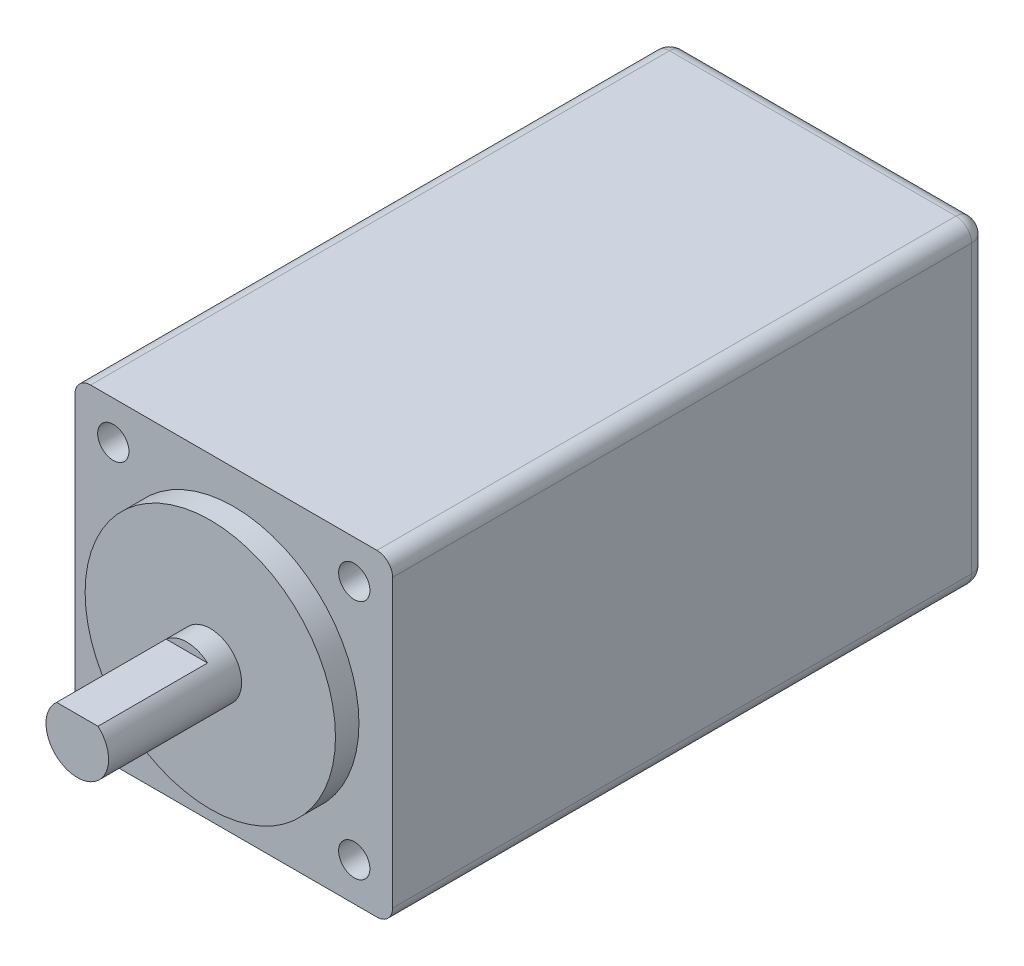
ISO-10303-21;
HEADER;
FILE_DESCRIPTION(('STEP AP214'),'2;1');
FILE_NAME('part.step','',(''),(''),'','','');
FILE_SCHEMA(('AUTOMOTIVE_DESIGN { 1 0 10303 214 1 1 1 1 }'));
ENDSEC;
DATA;
#1=APPLICATION_CONTEXT('core data for automotive mechanical design processes');
#2=APPLICATION_PROTOCOL_DEFINITION('international standard','automotive_design',2000,#1);
#3=PRODUCT_CONTEXT('',#1,'mechanical');
#4=PRODUCT('Part','Part','',(#3));
#5=PRODUCT_RELATED_PRODUCT_CATEGORY('part','',(#4));
#6=PRODUCT_DEFINITION_FORMATION('','',#4);
#7=PRODUCT_DEFINITION_CONTEXT('part definition',#1,'design');
#8=PRODUCT_DEFINITION('design','',#6,#7);
#9=PRODUCT_DEFINITION_SHAPE('','',#8);
#10=(LENGTH_UNIT() NAMED_UNIT(*) SI_UNIT(.MILLI.,.METRE.));
#11=(NAMED_UNIT(*) PLANE_ANGLE_UNIT() SI_UNIT($,.RADIAN.));
#12=(NAMED_UNIT(*) SI_UNIT($,.STERADIAN.) SOLID_ANGLE_UNIT());
#13=UNCERTAINTY_MEASURE_WITH_UNIT(LENGTH_MEASURE(1.E-05),#10,'distance_accuracy_value','');
#14=(GEOMETRIC_REPRESENTATION_CONTEXT(3) GLOBAL_UNCERTAINTY_ASSIGNED_CONTEXT((#13)) GLOBAL_UNIT_ASSIGNED_CONTEXT((#10,
#11,#12)) REPRESENTATION_CONTEXT('',''));
#15=CARTESIAN_POINT('',(0.,0.,0.));
#16=DIRECTION('',(0.,0.,1.));
#17=DIRECTION('',(1.,0.,0.));
#18=AXIS2_PLACEMENT_3D('',#15,#16,#17);
#19=CARTESIAN_POINT('',(0.,0.,39.5));
#20=DIRECTION('',(0.,0.,1.));
#21=DIRECTION('',(1.,0.,0.));
#22=AXIS2_PLACEMENT_3D('',#19,#20,#21);
#23=PLANE('',#22);
#24=CARTESIAN_POINT('',(0.,0.,39.5));
#25=DIRECTION('',(0.,0.,1.));
#26=DIRECTION('',(1.,0.,0.));
#27=AXIS2_PLACEMENT_3D('',#24,#25,#26);
#28=CIRCLE('',#27,8.);
#29=CARTESIAN_POINT('',(8.,0.,39.5));
#30=VERTEX_POINT('',#29);
#31=EDGE_CURVE('E144',#30,#30,#28,.T.);
#32=ORIENTED_EDGE('',*,*,#31,.T.);
#33=EDGE_LOOP('',(#32));
#34=FACE_BOUND('',#33,.T.);
#35=CARTESIAN_POINT('',(0.,0.,39.5));
#36=DIRECTION('',(0.,0.,1.));
#37=DIRECTION('',(1.,0.,0.));
#38=AXIS2_PLACEMENT_3D('',#35,#36,#37);
#39=CIRCLE('',#38,2.);
#40=CARTESIAN_POINT('',(2.,0.,39.5));
#41=VERTEX_POINT('',#40);
#42=EDGE_CURVE('E145',#41,#41,#39,.T.);
#43=ORIENTED_EDGE('',*,*,#42,.F.);
#44=EDGE_LOOP('',(#43));
#45=FACE_BOUND('',#44,.T.);
#46=ADVANCED_FACE('F33',(#34,#45),#23,.T.);
#47=CARTESIAN_POINT('',(10.15,10.15,38.));
#48=DIRECTION('',(0.,0.,-1.));
#49=DIRECTION('',(-1.,0.,0.));
#50=AXIS2_PLACEMENT_3D('',#47,#48,#49);
#51=PLANE('',#50);
#52=CARTESIAN_POINT('',(-7.69999999999969,-7.7,38.));
#53=DIRECTION('',(0.,0.,1.));
#54=DIRECTION('',(1.,0.,0.));
#55=AXIS2_PLACEMENT_3D('',#52,#53,#54);
#56=CIRCLE('',#55,1.);
#57=CARTESIAN_POINT('',(-6.69999999999969,-7.7,38.));
#58=VERTEX_POINT('',#57);
#59=EDGE_CURVE('E237',#58,#58,#56,.T.);
#60=ORIENTED_EDGE('',*,*,#59,.F.);
#61=EDGE_LOOP('',(#60));
#62=FACE_BOUND('',#61,.T.);
#63=CARTESIAN_POINT('',(7.70000000000031,-7.69999999999969,38.));
#64=DIRECTION('',(0.,0.,1.));
#65=DIRECTION('',(1.,0.,0.));
#66=AXIS2_PLACEMENT_3D('',#63,#64,#65);
#67=CIRCLE('',#66,1.);
#68=CARTESIAN_POINT('',(8.70000000000032,-7.69999999999969,38.));
#69=VERTEX_POINT('',#68);
#70=EDGE_CURVE('E245',#69,#69,#67,.T.);
#71=ORIENTED_EDGE('',*,*,#70,.F.);
#72=EDGE_LOOP('',(#71));
#73=FACE_BOUND('',#72,.T.);
#74=CARTESIAN_POINT('',(7.7,7.70000000000031,38.));
#75=DIRECTION('',(0.,0.,1.));
#76=DIRECTION('',(1.,0.,0.));
#77=AXIS2_PLACEMENT_3D('',#74,#75,#76);
#78=CIRCLE('',#77,1.);
#79=CARTESIAN_POINT('',(8.7,7.70000000000031,38.));
#80=VERTEX_POINT('',#79);
#81=EDGE_CURVE('E251',#80,#80,#78,.T.);
#82=ORIENTED_EDGE('',*,*,#81,.F.);
#83=EDGE_LOOP('',(#82));
#84=FACE_BOUND('',#83,.T.);
#85=CARTESIAN_POINT('',(-7.7,7.7,38.));
#86=DIRECTION('',(0.,0.,1.));
#87=DIRECTION('',(1.,0.,0.));
#88=AXIS2_PLACEMENT_3D('',#85,#86,#87);
#89=CIRCLE('',#88,1.);
#90=CARTESIAN_POINT('',(-6.7,7.7,38.));
#91=VERTEX_POINT('',#90);
#92=EDGE_CURVE('E257',#91,#91,#89,.T.);
#93=ORIENTED_EDGE('',*,*,#92,.F.);
#94=EDGE_LOOP('',(#93));
#95=FACE_BOUND('',#94,.T.);
#96=DIRECTION('',(0.,-1.,0.));
#97=VECTOR('',#96,1.);
#98=CARTESIAN_POINT('',(-10.15,-10.15,38.));
#99=LINE('',#98,#97);
#100=CARTESIAN_POINT('',(-10.15,9.15,38.));
#101=VERTEX_POINT('',#100);
#102=CARTESIAN_POINT('',(-10.15,-9.15,38.));
#103=VERTEX_POINT('',#102);
#104=EDGE_CURVE('E159',#101,#103,#99,.T.);
#105=ORIENTED_EDGE('',*,*,#104,.T.);
#106=CARTESIAN_POINT('',(-9.15,-9.15,38.));
#107=DIRECTION('',(0.,0.,-1.));
#108=DIRECTION('',(-1.,0.,0.));
#109=AXIS2_PLACEMENT_3D('',#106,#107,#108);
#110=CIRCLE('',#109,1.);
#111=CARTESIAN_POINT('',(-9.15,-10.15,38.));
#112=VERTEX_POINT('',#111);
#113=EDGE_CURVE('E11',#103,#112,#110,.F.);
#114=ORIENTED_EDGE('',*,*,#113,.T.);
#115=DIRECTION('',(1.,0.,0.));
#116=VECTOR('',#115,1.);
#117=CARTESIAN_POINT('',(-10.15,-10.15,38.));
#118=LINE('',#117,#116);
#119=CARTESIAN_POINT('',(9.15,-10.15,38.));
#120=VERTEX_POINT('',#119);
#121=EDGE_CURVE('E162',#112,#120,#118,.T.);
#122=ORIENTED_EDGE('',*,*,#121,.T.);
#123=CARTESIAN_POINT('',(9.15,-9.15,38.));
#124=DIRECTION('',(0.,0.,-1.));
#125=DIRECTION('',(-1.,0.,0.));
#126=AXIS2_PLACEMENT_3D('',#123,#124,#125);
#127=CIRCLE('',#126,1.);
#128=CARTESIAN_POINT('',(10.15,-9.15,38.));
#129=VERTEX_POINT('',#128);
#130=EDGE_CURVE('E42',#120,#129,#127,.F.);
#131=ORIENTED_EDGE('',*,*,#130,.T.);
#132=DIRECTION('',(0.,1.,0.));
#133=VECTOR('',#132,1.);
#134=CARTESIAN_POINT('',(10.15,-10.15,38.));
#135=LINE('',#134,#133);
#136=CARTESIAN_POINT('',(10.15,9.15,38.));
#137=VERTEX_POINT('',#136);
#138=EDGE_CURVE('E148',#129,#137,#135,.T.);
#139=ORIENTED_EDGE('',*,*,#138,.T.);
#140=CARTESIAN_POINT('',(9.15,9.15,38.));
#141=DIRECTION('',(0.,0.,-1.));
#142=DIRECTION('',(-1.,0.,0.));
#143=AXIS2_PLACEMENT_3D('',#140,#141,#142);
#144=CIRCLE('',#143,1.);
#145=CARTESIAN_POINT('',(9.15,10.15,38.));
#146=VERTEX_POINT('',#145);
#147=EDGE_CURVE('E200',#137,#146,#144,.F.);
#148=ORIENTED_EDGE('',*,*,#147,.T.);
#149=DIRECTION('',(-1.,0.,0.));
#150=VECTOR('',#149,1.);
#151=CARTESIAN_POINT('',(-10.15,10.15,38.));
#152=LINE('',#151,#150);
#153=CARTESIAN_POINT('',(-9.15,10.15,38.));
#154=VERTEX_POINT('',#153);
#155=EDGE_CURVE('E156',#146,#154,#152,.T.);
#156=ORIENTED_EDGE('',*,*,#155,.T.);
#157=CARTESIAN_POINT('',(-9.15,9.15,38.));
#158=DIRECTION('',(0.,0.,-1.));
#159=DIRECTION('',(-1.,0.,0.));
#160=AXIS2_PLACEMENT_3D('',#157,#158,#159);
#161=CIRCLE('',#160,1.);
#162=EDGE_CURVE('E202',#154,#101,#161,.F.);
#163=ORIENTED_EDGE('',*,*,#162,.T.);
#164=EDGE_LOOP('',(#105,#114,#122,#131,#139,#148,#156,#163));
#165=FACE_BOUND('',#164,.T.);
#166=CARTESIAN_POINT('',(0.,0.,38.));
#167=DIRECTION('',(0.,0.,-1.));
#168=DIRECTION('',(-1.,0.,0.));
#169=AXIS2_PLACEMENT_3D('',#166,#167,#168);
#170=CIRCLE('',#169,8.);
#171=CARTESIAN_POINT('',(-8.,0.,38.));
#172=VERTEX_POINT('',#171);
#173=EDGE_CURVE('E134',#172,#172,#170,.F.);
#174=ORIENTED_EDGE('',*,*,#173,.F.);
#175=EDGE_LOOP('',(#174));
#176=FACE_BOUND('',#175,.T.);
#177=ADVANCED_FACE('F278',(#62,#73,#84,#95,#165,#176),#51,.F.);
#178=CARTESIAN_POINT('',(10.15,-10.15,38.));
#179=DIRECTION('',(-1.,0.,0.));
#180=DIRECTION('',(0.,0.,1.));
#181=AXIS2_PLACEMENT_3D('',#178,#179,#180);
#182=PLANE('',#181);
#183=ORIENTED_EDGE('',*,*,#138,.F.);
#184=DIRECTION('',(0.,0.,-1.));
#185=VECTOR('',#184,1.);
#186=CARTESIAN_POINT('',(10.15,-9.15,38.));
#187=LINE('',#186,#185);
#188=CARTESIAN_POINT('',(10.15,-9.15,1.));
#189=VERTEX_POINT('',#188);
#190=EDGE_CURVE('E50',#129,#189,#187,.T.);
#191=ORIENTED_EDGE('',*,*,#190,.T.);
#192=DIRECTION('',(0.,1.,0.));
#193=VECTOR('',#192,1.);
#194=CARTESIAN_POINT('',(10.15,10.15,1.));
#195=LINE('',#194,#193);
#196=CARTESIAN_POINT('',(10.15,9.15,1.));
#197=VERTEX_POINT('',#196);
#198=EDGE_CURVE('E55',#189,#197,#195,.T.);
#199=ORIENTED_EDGE('',*,*,#198,.T.);
#200=DIRECTION('',(0.,0.,-1.));
#201=VECTOR('',#200,1.);
#202=CARTESIAN_POINT('',(10.15,9.15,38.));
#203=LINE('',#202,#201);
#204=EDGE_CURVE('E196',#197,#137,#203,.F.);
#205=ORIENTED_EDGE('',*,*,#204,.T.);
#206=EDGE_LOOP('',(#183,#191,#199,#205));
#207=FACE_BOUND('',#206,.T.);
#208=ADVANCED_FACE('F284',(#207),#182,.F.);
#209=CARTESIAN_POINT('',(-10.15,10.15,38.));
#210=DIRECTION('',(0.,-1.,0.));
#211=DIRECTION('',(0.,0.,-1.));
#212=AXIS2_PLACEMENT_3D('',#209,#210,#211);
#213=PLANE('',#212);
#214=DIRECTION('',(-1.,0.,0.));
#215=VECTOR('',#214,1.);
#216=CARTESIAN_POINT('',(-10.15,10.15,1.));
#217=LINE('',#216,#215);
#218=CARTESIAN_POINT('',(9.15,10.15,1.));
#219=VERTEX_POINT('',#218);
#220=CARTESIAN_POINT('',(-9.15,10.15,1.));
#221=VERTEX_POINT('',#220);
#222=EDGE_CURVE('E170',#219,#221,#217,.T.);
#223=ORIENTED_EDGE('',*,*,#222,.T.);
#224=DIRECTION('',(0.,0.,-1.));
#225=VECTOR('',#224,1.);
#226=CARTESIAN_POINT('',(-9.15,10.15,38.));
#227=LINE('',#226,#225);
#228=EDGE_CURVE('E173',#221,#154,#227,.F.);
#229=ORIENTED_EDGE('',*,*,#228,.T.);
#230=ORIENTED_EDGE('',*,*,#155,.F.);
#231=DIRECTION('',(0.,0.,-1.));
#232=VECTOR('',#231,1.);
#233=CARTESIAN_POINT('',(9.15,10.15,38.));
#234=LINE('',#233,#232);
#235=EDGE_CURVE('E168',#146,#219,#234,.T.);
#236=ORIENTED_EDGE('',*,*,#235,.T.);
#237=EDGE_LOOP('',(#223,#229,#230,#236));
#238=FACE_BOUND('',#237,.T.);
#239=ADVANCED_FACE('F305',(#238),#213,.F.);
#240=CARTESIAN_POINT('',(-10.15,-10.15,38.));
#241=DIRECTION('',(1.,0.,0.));
#242=DIRECTION('',(0.,0.,-1.));
#243=AXIS2_PLACEMENT_3D('',#240,#241,#242);
#244=PLANE('',#243);
#245=DIRECTION('',(0.,-1.,0.));
#246=VECTOR('',#245,1.);
#247=CARTESIAN_POINT('',(-10.15,-10.15,1.));
#248=LINE('',#247,#246);
#249=CARTESIAN_POINT('',(-10.15,9.15,1.));
#250=VERTEX_POINT('',#249);
#251=CARTESIAN_POINT('',(-10.15,-9.15,1.));
#252=VERTEX_POINT('',#251);
#253=EDGE_CURVE('E186',#250,#252,#248,.T.);
#254=ORIENTED_EDGE('',*,*,#253,.T.);
#255=DIRECTION('',(0.,0.,-1.));
#256=VECTOR('',#255,1.);
#257=CARTESIAN_POINT('',(-10.15,-9.15,38.));
#258=LINE('',#257,#256);
#259=EDGE_CURVE('E188',#252,#103,#258,.F.);
#260=ORIENTED_EDGE('',*,*,#259,.T.);
#261=ORIENTED_EDGE('',*,*,#104,.F.);
#262=DIRECTION('',(0.,0.,-1.));
#263=VECTOR('',#262,1.);
#264=CARTESIAN_POINT('',(-10.15,9.15,38.));
#265=LINE('',#264,#263);
#266=EDGE_CURVE('E184',#101,#250,#265,.T.);
#267=ORIENTED_EDGE('',*,*,#266,.T.);
#268=EDGE_LOOP('',(#254,#260,#261,#267));
#269=FACE_BOUND('',#268,.T.);
#270=ADVANCED_FACE('F301',(#269),#244,.F.);
#271=CARTESIAN_POINT('',(-10.15,-10.15,38.));
#272=DIRECTION('',(0.,1.,0.));
#273=DIRECTION('',(0.,0.,1.));
#274=AXIS2_PLACEMENT_3D('',#271,#272,#273);
#275=PLANE('',#274);
#276=ORIENTED_EDGE('',*,*,#121,.F.);
#277=DIRECTION('',(0.,0.,-1.));
#278=VECTOR('',#277,1.);
#279=CARTESIAN_POINT('',(-9.15,-10.15,38.));
#280=LINE('',#279,#278);
#281=CARTESIAN_POINT('',(-9.15,-10.15,1.));
#282=VERTEX_POINT('',#281);
#283=EDGE_CURVE('E194',#112,#282,#280,.T.);
#284=ORIENTED_EDGE('',*,*,#283,.T.);
#285=DIRECTION('',(1.,0.,0.));
#286=VECTOR('',#285,1.);
#287=CARTESIAN_POINT('',(10.15,-10.15,1.));
#288=LINE('',#287,#286);
#289=CARTESIAN_POINT('',(9.15,-10.15,1.));
#290=VERTEX_POINT('',#289);
#291=EDGE_CURVE('E192',#282,#290,#288,.T.);
#292=ORIENTED_EDGE('',*,*,#291,.T.);
#293=DIRECTION('',(0.,0.,-1.));
#294=VECTOR('',#293,1.);
#295=CARTESIAN_POINT('',(9.15,-10.15,38.));
#296=LINE('',#295,#294);
#297=EDGE_CURVE('E190',#290,#120,#296,.F.);
#298=ORIENTED_EDGE('',*,*,#297,.T.);
#299=EDGE_LOOP('',(#276,#284,#292,#298));
#300=FACE_BOUND('',#299,.T.);
#301=ADVANCED_FACE('F297',(#300),#275,.F.);
#302=CARTESIAN_POINT('',(10.15,10.15,0.));
#303=DIRECTION('',(0.,0.,-1.));
#304=DIRECTION('',(-1.,0.,0.));
#305=AXIS2_PLACEMENT_3D('',#302,#303,#304);
#306=PLANE('',#305);
#307=DIRECTION('',(0.,-1.,0.));
#308=VECTOR('',#307,1.);
#309=CARTESIAN_POINT('',(-9.15,10.15,0.));
#310=LINE('',#309,#308);
#311=CARTESIAN_POINT('',(-9.15,-9.15,0.));
#312=VERTEX_POINT('',#311);
#313=CARTESIAN_POINT('',(-9.15,9.15,0.));
#314=VERTEX_POINT('',#313);
#315=EDGE_CURVE('E179',#312,#314,#310,.F.);
#316=ORIENTED_EDGE('',*,*,#315,.T.);
#317=DIRECTION('',(-1.,0.,0.));
#318=VECTOR('',#317,1.);
#319=CARTESIAN_POINT('',(10.15,9.15,0.));
#320=LINE('',#319,#318);
#321=CARTESIAN_POINT('',(9.15,9.15,0.));
#322=VERTEX_POINT('',#321);
#323=EDGE_CURVE('E181',#314,#322,#320,.F.);
#324=ORIENTED_EDGE('',*,*,#323,.T.);
#325=DIRECTION('',(0.,1.,0.));
#326=VECTOR('',#325,1.);
#327=CARTESIAN_POINT('',(9.15,-10.15,0.));
#328=LINE('',#327,#326);
#329=CARTESIAN_POINT('',(9.15,-9.15,0.));
#330=VERTEX_POINT('',#329);
#331=EDGE_CURVE('E175',#322,#330,#328,.F.);
#332=ORIENTED_EDGE('',*,*,#331,.T.);
#333=DIRECTION('',(1.,0.,0.));
#334=VECTOR('',#333,1.);
#335=CARTESIAN_POINT('',(-10.15,-9.15,0.));
#336=LINE('',#335,#334);
#337=EDGE_CURVE('E177',#330,#312,#336,.F.);
#338=ORIENTED_EDGE('',*,*,#337,.T.);
#339=EDGE_LOOP('',(#316,#324,#332,#338));
#340=FACE_BOUND('',#339,.T.);
#341=ADVANCED_FACE('F292',(#340),#306,.T.);
#342=CARTESIAN_POINT('',(0.,0.,39.5));
#343=DIRECTION('',(0.,0.,-1.));
#344=DIRECTION('',(-1.,0.,0.));
#345=AXIS2_PLACEMENT_3D('',#342,#343,#344);
#346=CYLINDRICAL_SURFACE('',#345,8.);
#347=ORIENTED_EDGE('',*,*,#31,.F.);
#348=EDGE_LOOP('',(#347));
#349=FACE_BOUND('',#348,.T.);
#350=ORIENTED_EDGE('',*,*,#173,.T.);
#351=EDGE_LOOP('',(#350));
#352=FACE_BOUND('',#351,.T.);
#353=ADVANCED_FACE('F290',(#349,#352),#346,.T.);
#354=CARTESIAN_POINT('',(0.,0.,48.));
#355=DIRECTION('',(0.,0.,-1.));
#356=DIRECTION('',(-1.,0.,0.));
#357=AXIS2_PLACEMENT_3D('',#354,#355,#356);
#358=CYLINDRICAL_SURFACE('',#357,2.);
#359=CARTESIAN_POINT('',(0.,0.,48.));
#360=DIRECTION('',(0.,0.,1.));
#361=DIRECTION('',(1.,0.,0.));
#362=AXIS2_PLACEMENT_3D('',#359,#360,#361);
#363=CIRCLE('',#362,2.);
#364=CARTESIAN_POINT('',(-1.3228756555323,1.5,48.));
#365=VERTEX_POINT('',#364);
#366=CARTESIAN_POINT('',(1.3228756555323,1.5,48.));
#367=VERTEX_POINT('',#366);
#368=EDGE_CURVE('E140',#365,#367,#363,.T.);
#369=ORIENTED_EDGE('',*,*,#368,.F.);
#370=DIRECTION('',(0.,0.,-1.));
#371=VECTOR('',#370,1.);
#372=CARTESIAN_POINT('',(-1.3228756555323,1.5,48.));
#373=LINE('',#372,#371);
#374=CARTESIAN_POINT('',(-1.3228756555323,1.5,41.));
#375=VERTEX_POINT('',#374);
#376=EDGE_CURVE('E129',#365,#375,#373,.T.);
#377=ORIENTED_EDGE('',*,*,#376,.T.);
#378=CARTESIAN_POINT('',(0.,0.,41.));
#379=DIRECTION('',(0.,0.,-1.));
#380=DIRECTION('',(-1.,0.,0.));
#381=AXIS2_PLACEMENT_3D('',#378,#379,#380);
#382=CIRCLE('',#381,2.);
#383=CARTESIAN_POINT('',(1.3228756555323,1.5,41.));
#384=VERTEX_POINT('',#383);
#385=EDGE_CURVE('E133',#375,#384,#382,.T.);
#386=ORIENTED_EDGE('',*,*,#385,.T.);
#387=DIRECTION('',(0.,0.,-1.));
#388=VECTOR('',#387,1.);
#389=CARTESIAN_POINT('',(1.3228756555323,1.5,48.));
#390=LINE('',#389,#388);
#391=EDGE_CURVE('E126',#384,#367,#390,.F.);
#392=ORIENTED_EDGE('',*,*,#391,.T.);
#393=EDGE_LOOP('',(#369,#377,#386,#392));
#394=FACE_BOUND('',#393,.T.);
#395=ORIENTED_EDGE('',*,*,#42,.T.);
#396=EDGE_LOOP('',(#395));
#397=FACE_BOUND('',#396,.T.);
#398=ADVANCED_FACE('F138',(#394,#397),#358,.T.);
#399=CARTESIAN_POINT('',(0.,0.,48.));
#400=DIRECTION('',(0.,0.,1.));
#401=DIRECTION('',(1.,0.,0.));
#402=AXIS2_PLACEMENT_3D('',#399,#400,#401);
#403=PLANE('',#402);
#404=DIRECTION('',(1.,0.,0.));
#405=VECTOR('',#404,1.);
#406=CARTESIAN_POINT('',(0.,1.5,48.));
#407=LINE('',#406,#405);
#408=EDGE_CURVE('E122',#365,#367,#407,.T.);
#409=ORIENTED_EDGE('',*,*,#408,.F.);
#410=ORIENTED_EDGE('',*,*,#368,.T.);
#411=EDGE_LOOP('',(#409,#410));
#412=FACE_BOUND('',#411,.T.);
#413=ADVANCED_FACE('F143',(#412),#403,.T.);
#414=CARTESIAN_POINT('',(-5.,2.,41.));
#415=DIRECTION('',(0.,0.,-1.));
#416=DIRECTION('',(-1.,0.,0.));
#417=AXIS2_PLACEMENT_3D('',#414,#415,#416);
#418=PLANE('',#417);
#419=DIRECTION('',(1.,0.,0.));
#420=VECTOR('',#419,1.);
#421=CARTESIAN_POINT('',(-5.,1.5,41.));
#422=LINE('',#421,#420);
#423=EDGE_CURVE('E141',#375,#384,#422,.T.);
#424=ORIENTED_EDGE('',*,*,#423,.T.);
#425=ORIENTED_EDGE('',*,*,#385,.F.);
#426=EDGE_LOOP('',(#424,#425));
#427=FACE_BOUND('',#426,.T.);
#428=ADVANCED_FACE('F266',(#427),#418,.F.);
#429=CARTESIAN_POINT('',(-5.,1.5,48.));
#430=DIRECTION('',(0.,-1.,0.));
#431=DIRECTION('',(0.,0.,-1.));
#432=AXIS2_PLACEMENT_3D('',#429,#430,#431);
#433=PLANE('',#432);
#434=ORIENTED_EDGE('',*,*,#408,.T.);
#435=ORIENTED_EDGE('',*,*,#391,.F.);
#436=ORIENTED_EDGE('',*,*,#423,.F.);
#437=ORIENTED_EDGE('',*,*,#376,.F.);
#438=EDGE_LOOP('',(#434,#435,#436,#437));
#439=FACE_BOUND('',#438,.T.);
#440=ADVANCED_FACE('F124',(#439),#433,.F.);
#441=CARTESIAN_POINT('',(-7.7,7.7,35.5));
#442=DIRECTION('',(0.,0.,1.));
#443=DIRECTION('',(1.,0.,0.));
#444=AXIS2_PLACEMENT_3D('',#441,#442,#443);
#445=CYLINDRICAL_SURFACE('',#444,1.);
#446=CARTESIAN_POINT('',(-7.7,7.7,35.5));
#447=DIRECTION('',(0.,0.,1.));
#448=DIRECTION('',(1.,0.,0.));
#449=AXIS2_PLACEMENT_3D('',#446,#447,#448);
#450=CIRCLE('',#449,1.);
#451=CARTESIAN_POINT('',(-6.7,7.7,35.5));
#452=VERTEX_POINT('',#451);
#453=EDGE_CURVE('E260',#452,#452,#450,.T.);
#454=ORIENTED_EDGE('',*,*,#453,.F.);
#455=EDGE_LOOP('',(#454));
#456=FACE_BOUND('',#455,.T.);
#457=ORIENTED_EDGE('',*,*,#92,.T.);
#458=EDGE_LOOP('',(#457));
#459=FACE_BOUND('',#458,.T.);
#460=ADVANCED_FACE('F273',(#456,#459),#445,.F.);
#461=CARTESIAN_POINT('',(-7.7,7.7,35.5));
#462=DIRECTION('',(0.,0.,1.));
#463=DIRECTION('',(1.,0.,0.));
#464=AXIS2_PLACEMENT_3D('',#461,#462,#463);
#465=PLANE('',#464);
#466=ORIENTED_EDGE('',*,*,#453,.T.);
#467=EDGE_LOOP('',(#466));
#468=FACE_BOUND('',#467,.T.);
#469=ADVANCED_FACE('F418',(#468),#465,.T.);
#470=CARTESIAN_POINT('',(7.7,7.70000000000031,35.5));
#471=DIRECTION('',(0.,0.,1.));
#472=DIRECTION('',(1.,0.,0.));
#473=AXIS2_PLACEMENT_3D('',#470,#471,#472);
#474=CYLINDRICAL_SURFACE('',#473,1.);
#475=CARTESIAN_POINT('',(7.7,7.70000000000031,35.5));
#476=DIRECTION('',(0.,0.,1.));
#477=DIRECTION('',(1.,0.,0.));
#478=AXIS2_PLACEMENT_3D('',#475,#476,#477);
#479=CIRCLE('',#478,1.);
#480=CARTESIAN_POINT('',(8.7,7.70000000000031,35.5));
#481=VERTEX_POINT('',#480);
#482=EDGE_CURVE('E254',#481,#481,#479,.T.);
#483=ORIENTED_EDGE('',*,*,#482,.F.);
#484=EDGE_LOOP('',(#483));
#485=FACE_BOUND('',#484,.T.);
#486=ORIENTED_EDGE('',*,*,#81,.T.);
#487=EDGE_LOOP('',(#486));
#488=FACE_BOUND('',#487,.T.);
#489=ADVANCED_FACE('F414',(#485,#488),#474,.F.);
#490=CARTESIAN_POINT('',(7.7,7.70000000000031,35.5));
#491=DIRECTION('',(0.,0.,1.));
#492=DIRECTION('',(1.,0.,0.));
#493=AXIS2_PLACEMENT_3D('',#490,#491,#492);
#494=PLANE('',#493);
#495=ORIENTED_EDGE('',*,*,#482,.T.);
#496=EDGE_LOOP('',(#495));
#497=FACE_BOUND('',#496,.T.);
#498=ADVANCED_FACE('F410',(#497),#494,.T.);
#499=CARTESIAN_POINT('',(7.70000000000031,-7.69999999999969,35.5));
#500=DIRECTION('',(0.,0.,1.));
#501=DIRECTION('',(1.,0.,0.));
#502=AXIS2_PLACEMENT_3D('',#499,#500,#501);
#503=CYLINDRICAL_SURFACE('',#502,1.);
#504=CARTESIAN_POINT('',(7.70000000000031,-7.69999999999969,35.5));
#505=DIRECTION('',(0.,0.,1.));
#506=DIRECTION('',(1.,0.,0.));
#507=AXIS2_PLACEMENT_3D('',#504,#505,#506);
#508=CIRCLE('',#507,1.);
#509=CARTESIAN_POINT('',(8.70000000000032,-7.69999999999969,35.5));
#510=VERTEX_POINT('',#509);
#511=EDGE_CURVE('E248',#510,#510,#508,.T.);
#512=ORIENTED_EDGE('',*,*,#511,.F.);
#513=EDGE_LOOP('',(#512));
#514=FACE_BOUND('',#513,.T.);
#515=ORIENTED_EDGE('',*,*,#70,.T.);
#516=EDGE_LOOP('',(#515));
#517=FACE_BOUND('',#516,.T.);
#518=ADVANCED_FACE('F406',(#514,#517),#503,.F.);
#519=CARTESIAN_POINT('',(7.70000000000031,-7.69999999999969,35.5));
#520=DIRECTION('',(0.,0.,1.));
#521=DIRECTION('',(1.,0.,0.));
#522=AXIS2_PLACEMENT_3D('',#519,#520,#521);
#523=PLANE('',#522);
#524=ORIENTED_EDGE('',*,*,#511,.T.);
#525=EDGE_LOOP('',(#524));
#526=FACE_BOUND('',#525,.T.);
#527=ADVANCED_FACE('F400',(#526),#523,.T.);
#528=CARTESIAN_POINT('',(-7.69999999999969,-7.7,35.5));
#529=DIRECTION('',(0.,0.,1.));
#530=DIRECTION('',(1.,0.,0.));
#531=AXIS2_PLACEMENT_3D('',#528,#529,#530);
#532=CYLINDRICAL_SURFACE('',#531,1.);
#533=CARTESIAN_POINT('',(-7.69999999999969,-7.7,35.5));
#534=DIRECTION('',(0.,0.,1.));
#535=DIRECTION('',(1.,0.,0.));
#536=AXIS2_PLACEMENT_3D('',#533,#534,#535);
#537=CIRCLE('',#536,1.);
#538=CARTESIAN_POINT('',(-6.69999999999969,-7.7,35.5));
#539=VERTEX_POINT('',#538);
#540=EDGE_CURVE('E240',#539,#539,#537,.T.);
#541=ORIENTED_EDGE('',*,*,#540,.F.);
#542=EDGE_LOOP('',(#541));
#543=FACE_BOUND('',#542,.T.);
#544=ORIENTED_EDGE('',*,*,#59,.T.);
#545=EDGE_LOOP('',(#544));
#546=FACE_BOUND('',#545,.T.);
#547=ADVANCED_FACE('F394',(#543,#546),#532,.F.);
#548=CARTESIAN_POINT('',(-7.69999999999969,-7.7,35.5));
#549=DIRECTION('',(0.,0.,1.));
#550=DIRECTION('',(1.,0.,0.));
#551=AXIS2_PLACEMENT_3D('',#548,#549,#550);
#552=PLANE('',#551);
#553=ORIENTED_EDGE('',*,*,#540,.T.);
#554=EDGE_LOOP('',(#553));
#555=FACE_BOUND('',#554,.T.);
#556=ADVANCED_FACE('F356',(#555),#552,.T.);
#557=CARTESIAN_POINT('',(9.15,-9.15,38.));
#558=DIRECTION('',(0.,0.,-1.));
#559=DIRECTION('',(-1.,0.,0.));
#560=AXIS2_PLACEMENT_3D('',#557,#558,#559);
#561=CYLINDRICAL_SURFACE('',#560,1.);
#562=ORIENTED_EDGE('',*,*,#130,.F.);
#563=ORIENTED_EDGE('',*,*,#297,.F.);
#564=CARTESIAN_POINT('',(9.15,-9.15,1.));
#565=DIRECTION('',(0.,0.,-1.));
#566=DIRECTION('',(-1.,0.,0.));
#567=AXIS2_PLACEMENT_3D('',#564,#565,#566);
#568=CIRCLE('',#567,1.);
#569=EDGE_CURVE('E232',#189,#290,#568,.T.);
#570=ORIENTED_EDGE('',*,*,#569,.F.);
#571=ORIENTED_EDGE('',*,*,#190,.F.);
#572=EDGE_LOOP('',(#562,#563,#570,#571));
#573=FACE_BOUND('',#572,.T.);
#574=ADVANCED_FACE('F35',(#573),#561,.T.);
#575=CARTESIAN_POINT('',(-9.15,-9.15,38.));
#576=DIRECTION('',(0.,0.,-1.));
#577=DIRECTION('',(-1.,0.,0.));
#578=AXIS2_PLACEMENT_3D('',#575,#576,#577);
#579=CYLINDRICAL_SURFACE('',#578,1.);
#580=ORIENTED_EDGE('',*,*,#113,.F.);
#581=ORIENTED_EDGE('',*,*,#259,.F.);
#582=CARTESIAN_POINT('',(-9.15,-9.15,1.));
#583=DIRECTION('',(0.,0.,-1.));
#584=DIRECTION('',(-1.,0.,0.));
#585=AXIS2_PLACEMENT_3D('',#582,#583,#584);
#586=CIRCLE('',#585,1.);
#587=EDGE_CURVE('E230',#282,#252,#586,.T.);
#588=ORIENTED_EDGE('',*,*,#587,.F.);
#589=ORIENTED_EDGE('',*,*,#283,.F.);
#590=EDGE_LOOP('',(#580,#581,#588,#589));
#591=FACE_BOUND('',#590,.T.);
#592=ADVANCED_FACE('F349',(#591),#579,.T.);
#593=CARTESIAN_POINT('',(-10.15,-9.15,1.));
#594=DIRECTION('',(-1.,0.,0.));
#595=DIRECTION('',(0.,0.,1.));
#596=AXIS2_PLACEMENT_3D('',#593,#594,#595);
#597=CYLINDRICAL_SURFACE('',#596,1.);
#598=CARTESIAN_POINT('',(9.15,-9.15,1.));
#599=DIRECTION('',(1.,0.,0.));
#600=DIRECTION('',(0.,0.,-1.));
#601=AXIS2_PLACEMENT_3D('',#598,#599,#600);
#602=CIRCLE('',#601,1.);
#603=EDGE_CURVE('E37',#290,#330,#602,.T.);
#604=ORIENTED_EDGE('',*,*,#603,.F.);
#605=ORIENTED_EDGE('',*,*,#291,.F.);
#606=CARTESIAN_POINT('',(-9.15,-9.15,1.));
#607=DIRECTION('',(-1.,0.,0.));
#608=DIRECTION('',(0.,0.,1.));
#609=AXIS2_PLACEMENT_3D('',#606,#607,#608);
#610=CIRCLE('',#609,1.);
#611=EDGE_CURVE('E227',#312,#282,#610,.T.);
#612=ORIENTED_EDGE('',*,*,#611,.F.);
#613=ORIENTED_EDGE('',*,*,#337,.F.);
#614=EDGE_LOOP('',(#604,#605,#612,#613));
#615=FACE_BOUND('',#614,.T.);
#616=ADVANCED_FACE('F347',(#615),#597,.T.);
#617=CARTESIAN_POINT('',(9.15,-9.15,1.));
#618=DIRECTION('',(0.,0.,1.));
#619=DIRECTION('',(1.,0.,0.));
#620=AXIS2_PLACEMENT_3D('',#617,#618,#619);
#621=SPHERICAL_SURFACE('',#620,1.);
#622=ORIENTED_EDGE('',*,*,#569,.T.);
#623=ORIENTED_EDGE('',*,*,#603,.T.);
#624=CARTESIAN_POINT('',(9.15,-9.15,1.));
#625=DIRECTION('',(0.,-1.,0.));
#626=DIRECTION('',(0.,0.,-1.));
#627=AXIS2_PLACEMENT_3D('',#624,#625,#626);
#628=CIRCLE('',#627,1.);
#629=EDGE_CURVE('E224',#189,#330,#628,.F.);
#630=ORIENTED_EDGE('',*,*,#629,.F.);
#631=EDGE_LOOP('',(#622,#623,#630));
#632=FACE_BOUND('',#631,.T.);
#633=ADVANCED_FACE('F343',(#632),#621,.T.);
#634=CARTESIAN_POINT('',(-9.15,-9.15,1.));
#635=DIRECTION('',(0.,0.,1.));
#636=DIRECTION('',(1.,0.,0.));
#637=AXIS2_PLACEMENT_3D('',#634,#635,#636);
#638=SPHERICAL_SURFACE('',#637,1.);
#639=ORIENTED_EDGE('',*,*,#611,.T.);
#640=ORIENTED_EDGE('',*,*,#587,.T.);
#641=CARTESIAN_POINT('',(-9.15,-9.15,1.));
#642=DIRECTION('',(0.,-1.,0.));
#643=DIRECTION('',(0.,0.,-1.));
#644=AXIS2_PLACEMENT_3D('',#641,#642,#643);
#645=CIRCLE('',#644,1.);
#646=EDGE_CURVE('E221',#312,#252,#645,.F.);
#647=ORIENTED_EDGE('',*,*,#646,.F.);
#648=EDGE_LOOP('',(#639,#640,#647));
#649=FACE_BOUND('',#648,.T.);
#650=ADVANCED_FACE('F339',(#649),#638,.T.);
#651=CARTESIAN_POINT('',(9.15,-10.15,1.));
#652=DIRECTION('',(0.,-1.,0.));
#653=DIRECTION('',(0.,0.,-1.));
#654=AXIS2_PLACEMENT_3D('',#651,#652,#653);
#655=CYLINDRICAL_SURFACE('',#654,1.);
#656=ORIENTED_EDGE('',*,*,#629,.T.);
#657=ORIENTED_EDGE('',*,*,#331,.F.);
#658=CARTESIAN_POINT('',(9.15,9.15,1.));
#659=DIRECTION('',(0.,1.,0.));
#660=DIRECTION('',(0.,0.,1.));
#661=AXIS2_PLACEMENT_3D('',#658,#659,#660);
#662=CIRCLE('',#661,1.);
#663=EDGE_CURVE('E218',#197,#322,#662,.T.);
#664=ORIENTED_EDGE('',*,*,#663,.F.);
#665=ORIENTED_EDGE('',*,*,#198,.F.);
#666=EDGE_LOOP('',(#656,#657,#664,#665));
#667=FACE_BOUND('',#666,.T.);
#668=ADVANCED_FACE('F335',(#667),#655,.T.);
#669=CARTESIAN_POINT('',(9.15,9.15,38.));
#670=DIRECTION('',(0.,0.,-1.));
#671=DIRECTION('',(-1.,0.,0.));
#672=AXIS2_PLACEMENT_3D('',#669,#670,#671);
#673=CYLINDRICAL_SURFACE('',#672,1.);
#674=ORIENTED_EDGE('',*,*,#147,.F.);
#675=ORIENTED_EDGE('',*,*,#204,.F.);
#676=CARTESIAN_POINT('',(9.15,9.15,1.));
#677=DIRECTION('',(0.,0.,-1.));
#678=DIRECTION('',(-1.,0.,0.));
#679=AXIS2_PLACEMENT_3D('',#676,#677,#678);
#680=CIRCLE('',#679,1.);
#681=EDGE_CURVE('E215',#219,#197,#680,.T.);
#682=ORIENTED_EDGE('',*,*,#681,.F.);
#683=ORIENTED_EDGE('',*,*,#235,.F.);
#684=EDGE_LOOP('',(#674,#675,#682,#683));
#685=FACE_BOUND('',#684,.T.);
#686=ADVANCED_FACE('F331',(#685),#673,.T.);
#687=CARTESIAN_POINT('',(-9.15,9.15,38.));
#688=DIRECTION('',(0.,0.,-1.));
#689=DIRECTION('',(-1.,0.,0.));
#690=AXIS2_PLACEMENT_3D('',#687,#688,#689);
#691=CYLINDRICAL_SURFACE('',#690,1.);
#692=ORIENTED_EDGE('',*,*,#162,.F.);
#693=ORIENTED_EDGE('',*,*,#228,.F.);
#694=CARTESIAN_POINT('',(-9.15,9.15,1.));
#695=DIRECTION('',(0.,0.,-1.));
#696=DIRECTION('',(-1.,0.,0.));
#697=AXIS2_PLACEMENT_3D('',#694,#695,#696);
#698=CIRCLE('',#697,1.);
#699=EDGE_CURVE('E212',#250,#221,#698,.T.);
#700=ORIENTED_EDGE('',*,*,#699,.F.);
#701=ORIENTED_EDGE('',*,*,#266,.F.);
#702=EDGE_LOOP('',(#692,#693,#700,#701));
#703=FACE_BOUND('',#702,.T.);
#704=ADVANCED_FACE('F327',(#703),#691,.T.);
#705=CARTESIAN_POINT('',(-9.15,-10.15,1.));
#706=DIRECTION('',(0.,1.,0.));
#707=DIRECTION('',(0.,0.,1.));
#708=AXIS2_PLACEMENT_3D('',#705,#706,#707);
#709=CYLINDRICAL_SURFACE('',#708,1.);
#710=ORIENTED_EDGE('',*,*,#646,.T.);
#711=ORIENTED_EDGE('',*,*,#253,.F.);
#712=CARTESIAN_POINT('',(-9.15,9.15,1.));
#713=DIRECTION('',(0.,1.,0.));
#714=DIRECTION('',(0.,0.,1.));
#715=AXIS2_PLACEMENT_3D('',#712,#713,#714);
#716=CIRCLE('',#715,1.);
#717=EDGE_CURVE('E209',#314,#250,#716,.T.);
#718=ORIENTED_EDGE('',*,*,#717,.F.);
#719=ORIENTED_EDGE('',*,*,#315,.F.);
#720=EDGE_LOOP('',(#710,#711,#718,#719));
#721=FACE_BOUND('',#720,.T.);
#722=ADVANCED_FACE('F323',(#721),#709,.T.);
#723=CARTESIAN_POINT('',(9.15,9.15,1.));
#724=DIRECTION('',(0.,0.,1.));
#725=DIRECTION('',(1.,0.,0.));
#726=AXIS2_PLACEMENT_3D('',#723,#724,#725);
#727=SPHERICAL_SURFACE('',#726,1.);
#728=ORIENTED_EDGE('',*,*,#681,.T.);
#729=ORIENTED_EDGE('',*,*,#663,.T.);
#730=CARTESIAN_POINT('',(9.15,9.15,1.));
#731=DIRECTION('',(1.,0.,0.));
#732=DIRECTION('',(0.,0.,-1.));
#733=AXIS2_PLACEMENT_3D('',#730,#731,#732);
#734=CIRCLE('',#733,1.);
#735=EDGE_CURVE('E207',#219,#322,#734,.F.);
#736=ORIENTED_EDGE('',*,*,#735,.F.);
#737=EDGE_LOOP('',(#728,#729,#736));
#738=FACE_BOUND('',#737,.T.);
#739=ADVANCED_FACE('F319',(#738),#727,.T.);
#740=CARTESIAN_POINT('',(-9.15,9.15,1.));
#741=DIRECTION('',(0.,0.,1.));
#742=DIRECTION('',(1.,0.,0.));
#743=AXIS2_PLACEMENT_3D('',#740,#741,#742);
#744=SPHERICAL_SURFACE('',#743,1.);
#745=ORIENTED_EDGE('',*,*,#717,.T.);
#746=ORIENTED_EDGE('',*,*,#699,.T.);
#747=CARTESIAN_POINT('',(-9.15,9.15,1.));
#748=DIRECTION('',(-1.,0.,0.));
#749=DIRECTION('',(0.,0.,1.));
#750=AXIS2_PLACEMENT_3D('',#747,#748,#749);
#751=CIRCLE('',#750,1.);
#752=EDGE_CURVE('E205',#314,#221,#751,.F.);
#753=ORIENTED_EDGE('',*,*,#752,.F.);
#754=EDGE_LOOP('',(#745,#746,#753));
#755=FACE_BOUND('',#754,.T.);
#756=ADVANCED_FACE('F315',(#755),#744,.T.);
#757=CARTESIAN_POINT('',(-10.15,9.15,1.));
#758=DIRECTION('',(1.,0.,0.));
#759=DIRECTION('',(0.,0.,-1.));
#760=AXIS2_PLACEMENT_3D('',#757,#758,#759);
#761=CYLINDRICAL_SURFACE('',#760,1.);
#762=ORIENTED_EDGE('',*,*,#735,.T.);
#763=ORIENTED_EDGE('',*,*,#323,.F.);
#764=ORIENTED_EDGE('',*,*,#752,.T.);
#765=ORIENTED_EDGE('',*,*,#222,.F.);
#766=EDGE_LOOP('',(#762,#763,#764,#765));
#767=FACE_BOUND('',#766,.T.);
#768=ADVANCED_FACE('F312',(#767),#761,.T.);
#769=CLOSED_SHELL('',(#46,#177,#208,#239,#270,#301,#341,#353,#398,#413,#428,#440,#460,#469,#489,
#498,#518,#527,#547,#556,#574,#592,#616,#633,#650,#668,#686,#704,#722,#739,#756,#768));
#770=MANIFOLD_SOLID_BREP('B2',#769);
#771=ADVANCED_BREP_SHAPE_REPRESENTATION('',(#18,#770),#14);
#772=SHAPE_DEFINITION_REPRESENTATION(#9,#771);
ENDSEC;
END-ISO-10303-21;
